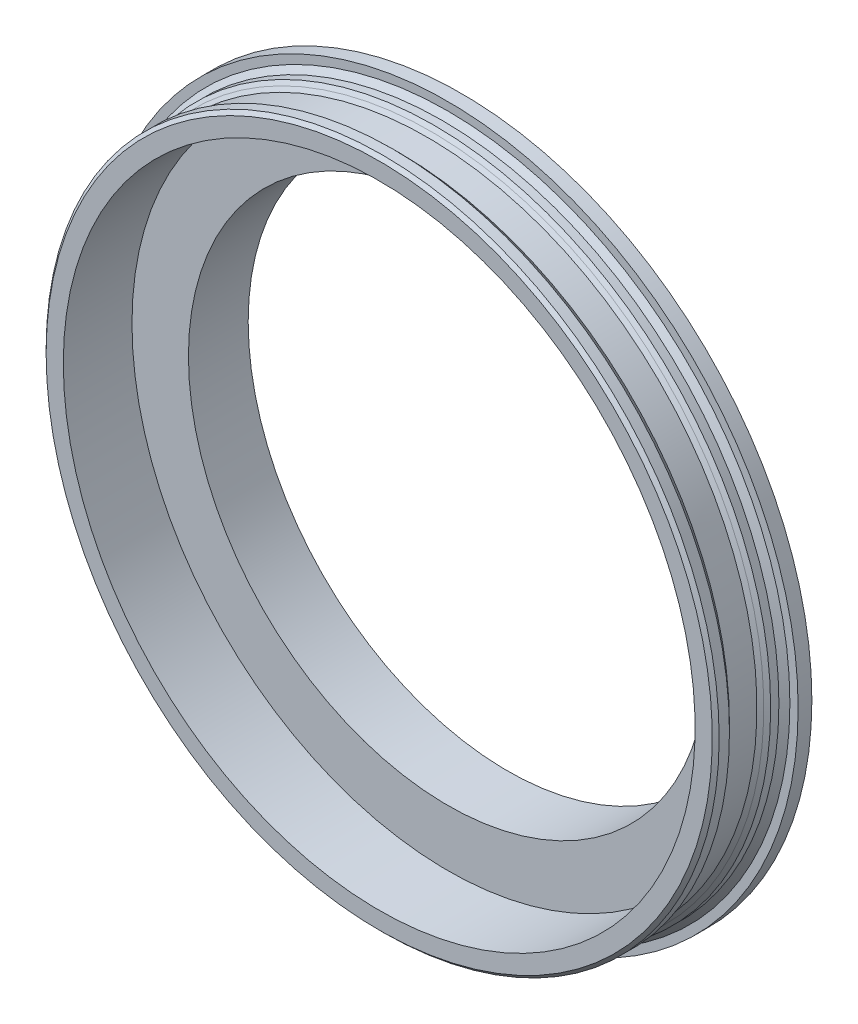
ISO-10303-21;
HEADER;
FILE_DESCRIPTION(('STEP AP214'),'2;1');
FILE_NAME('part.step','',(''),(''),'','','');
FILE_SCHEMA(('AUTOMOTIVE_DESIGN { 1 0 10303 214 1 1 1 1 }'));
ENDSEC;
DATA;
#1=APPLICATION_CONTEXT('core data for automotive mechanical design processes');
#2=APPLICATION_PROTOCOL_DEFINITION('international standard','automotive_design',2000,#1);
#3=PRODUCT_CONTEXT('',#1,'mechanical');
#4=PRODUCT('Part','Part','',(#3));
#5=PRODUCT_RELATED_PRODUCT_CATEGORY('part','',(#4));
#6=PRODUCT_DEFINITION_FORMATION('','',#4);
#7=PRODUCT_DEFINITION_CONTEXT('part definition',#1,'design');
#8=PRODUCT_DEFINITION('design','',#6,#7);
#9=PRODUCT_DEFINITION_SHAPE('','',#8);
#10=(LENGTH_UNIT() NAMED_UNIT(*) SI_UNIT(.MILLI.,.METRE.));
#11=(NAMED_UNIT(*) PLANE_ANGLE_UNIT() SI_UNIT($,.RADIAN.));
#12=(NAMED_UNIT(*) SI_UNIT($,.STERADIAN.) SOLID_ANGLE_UNIT());
#13=UNCERTAINTY_MEASURE_WITH_UNIT(LENGTH_MEASURE(1.E-05),#10,'distance_accuracy_value','');
#14=(GEOMETRIC_REPRESENTATION_CONTEXT(3) GLOBAL_UNCERTAINTY_ASSIGNED_CONTEXT((#13)) GLOBAL_UNIT_ASSIGNED_CONTEXT((#10,
#11,#12)) REPRESENTATION_CONTEXT('',''));
#15=CARTESIAN_POINT('',(0.,0.,0.));
#16=DIRECTION('',(0.,0.,1.));
#17=DIRECTION('',(1.,0.,0.));
#18=AXIS2_PLACEMENT_3D('',#15,#16,#17);
#19=CARTESIAN_POINT('',(39.78,0.,0.));
#20=DIRECTION('',(0.,0.,1.));
#21=DIRECTION('',(1.,0.,0.));
#22=AXIS2_PLACEMENT_3D('',#19,#20,#21);
#23=PLANE('',#22);
#24=CARTESIAN_POINT('',(0.,0.,0.));
#25=DIRECTION('',(0.,0.,1.));
#26=DIRECTION('',(1.,0.,0.));
#27=AXIS2_PLACEMENT_3D('',#24,#25,#26);
#28=CIRCLE('',#27,39.28);
#29=CARTESIAN_POINT('',(39.28,0.,0.));
#30=VERTEX_POINT('',#29);
#31=EDGE_CURVE('E70',#30,#30,#28,.F.);
#32=ORIENTED_EDGE('',*,*,#31,.T.);
#33=EDGE_LOOP('',(#32));
#34=FACE_BOUND('',#33,.T.);
#35=CARTESIAN_POINT('',(0.,0.,0.));
#36=DIRECTION('',(0.,0.,-1.));
#37=DIRECTION('',(-1.,0.,0.));
#38=AXIS2_PLACEMENT_3D('',#35,#36,#37);
#39=CIRCLE('',#38,37.78);
#40=CARTESIAN_POINT('',(-37.78,0.,0.));
#41=VERTEX_POINT('',#40);
#42=EDGE_CURVE('E82',#41,#41,#39,.T.);
#43=ORIENTED_EDGE('',*,*,#42,.F.);
#44=EDGE_LOOP('',(#43));
#45=FACE_BOUND('',#44,.T.);
#46=ADVANCED_FACE('F37',(#34,#45),#23,.F.);
#47=CARTESIAN_POINT('',(0.,0.,-73.9813673678491));
#48=DIRECTION('',(0.,0.,-1.));
#49=DIRECTION('',(-1.,0.,0.));
#50=AXIS2_PLACEMENT_3D('',#47,#48,#49);
#51=CYLINDRICAL_SURFACE('',#50,37.78);
#52=CARTESIAN_POINT('',(0.,0.,8.7));
#53=DIRECTION('',(0.,0.,-1.));
#54=DIRECTION('',(-1.,0.,0.));
#55=AXIS2_PLACEMENT_3D('',#52,#53,#54);
#56=CIRCLE('',#55,37.78);
#57=CARTESIAN_POINT('',(-37.78,0.,8.7));
#58=VERTEX_POINT('',#57);
#59=EDGE_CURVE('E85',#58,#58,#56,.T.);
#60=ORIENTED_EDGE('',*,*,#59,.F.);
#61=EDGE_LOOP('',(#60));
#62=FACE_BOUND('',#61,.T.);
#63=ORIENTED_EDGE('',*,*,#42,.T.);
#64=EDGE_LOOP('',(#63));
#65=FACE_BOUND('',#64,.T.);
#66=ADVANCED_FACE('F127',(#62,#65),#51,.F.);
#67=CARTESIAN_POINT('',(37.78,0.,8.7));
#68=DIRECTION('',(0.,0.,-1.));
#69=DIRECTION('',(-1.,0.,0.));
#70=AXIS2_PLACEMENT_3D('',#67,#68,#69);
#71=PLANE('',#70);
#72=CARTESIAN_POINT('',(0.,0.,8.7));
#73=DIRECTION('',(0.,0.,-1.));
#74=DIRECTION('',(-1.,0.,0.));
#75=AXIS2_PLACEMENT_3D('',#72,#73,#74);
#76=CIRCLE('',#75,46.);
#77=CARTESIAN_POINT('',(-46.,0.,8.7));
#78=VERTEX_POINT('',#77);
#79=EDGE_CURVE('E88',#78,#78,#76,.T.);
#80=ORIENTED_EDGE('',*,*,#79,.F.);
#81=EDGE_LOOP('',(#80));
#82=FACE_BOUND('',#81,.T.);
#83=ORIENTED_EDGE('',*,*,#59,.T.);
#84=EDGE_LOOP('',(#83));
#85=FACE_BOUND('',#84,.T.);
#86=ADVANCED_FACE('F133',(#82,#85),#71,.F.);
#87=CARTESIAN_POINT('',(0.,0.,-73.9813673678491));
#88=DIRECTION('',(0.,0.,-1.));
#89=DIRECTION('',(-1.,0.,0.));
#90=AXIS2_PLACEMENT_3D('',#87,#88,#89);
#91=CYLINDRICAL_SURFACE('',#90,46.);
#92=CARTESIAN_POINT('',(0.,0.,18.7));
#93=DIRECTION('',(0.,0.,-1.));
#94=DIRECTION('',(-1.,0.,0.));
#95=AXIS2_PLACEMENT_3D('',#92,#93,#94);
#96=CIRCLE('',#95,46.);
#97=CARTESIAN_POINT('',(-46.,0.,18.7));
#98=VERTEX_POINT('',#97);
#99=EDGE_CURVE('E91',#98,#98,#96,.T.);
#100=ORIENTED_EDGE('',*,*,#99,.F.);
#101=EDGE_LOOP('',(#100));
#102=FACE_BOUND('',#101,.T.);
#103=ORIENTED_EDGE('',*,*,#79,.T.);
#104=EDGE_LOOP('',(#103));
#105=FACE_BOUND('',#104,.T.);
#106=ADVANCED_FACE('F182',(#102,#105),#91,.F.);
#107=CARTESIAN_POINT('',(46.,0.,18.7));
#108=DIRECTION('',(0.,0.,-1.));
#109=DIRECTION('',(-1.,0.,0.));
#110=AXIS2_PLACEMENT_3D('',#107,#108,#109);
#111=PLANE('',#110);
#112=CARTESIAN_POINT('',(0.,0.,18.7));
#113=DIRECTION('',(0.,0.,-1.));
#114=DIRECTION('',(-1.,0.,0.));
#115=AXIS2_PLACEMENT_3D('',#112,#113,#114);
#116=CIRCLE('',#115,48.5);
#117=CARTESIAN_POINT('',(-48.5,0.,18.7));
#118=VERTEX_POINT('',#117);
#119=EDGE_CURVE('E73',#118,#118,#116,.F.);
#120=ORIENTED_EDGE('',*,*,#119,.T.);
#121=EDGE_LOOP('',(#120));
#122=FACE_BOUND('',#121,.T.);
#123=ORIENTED_EDGE('',*,*,#99,.T.);
#124=EDGE_LOOP('',(#123));
#125=FACE_BOUND('',#124,.T.);
#126=ADVANCED_FACE('F176',(#122,#125),#111,.F.);
#127=CARTESIAN_POINT('',(0.,0.,-73.9813673678491));
#128=DIRECTION('',(0.,0.,-1.));
#129=DIRECTION('',(-1.,0.,0.));
#130=AXIS2_PLACEMENT_3D('',#127,#128,#129);
#131=CYLINDRICAL_SURFACE('',#130,49.);
#132=CARTESIAN_POINT('',(0.,0.,18.2));
#133=DIRECTION('',(0.,0.,-1.));
#134=DIRECTION('',(-1.,0.,0.));
#135=AXIS2_PLACEMENT_3D('',#132,#133,#134);
#136=CIRCLE('',#135,49.);
#137=CARTESIAN_POINT('',(-49.,0.,18.2));
#138=VERTEX_POINT('',#137);
#139=EDGE_CURVE('E76',#138,#138,#136,.T.);
#140=ORIENTED_EDGE('',*,*,#139,.T.);
#141=EDGE_LOOP('',(#140));
#142=FACE_BOUND('',#141,.T.);
#143=CARTESIAN_POINT('',(0.,0.,16.7));
#144=DIRECTION('',(0.,0.,1.));
#145=DIRECTION('',(1.,0.,0.));
#146=AXIS2_PLACEMENT_3D('',#143,#144,#145);
#147=CIRCLE('',#146,49.);
#148=CARTESIAN_POINT('',(49.,0.,16.7));
#149=VERTEX_POINT('',#148);
#150=EDGE_CURVE('E79',#149,#149,#147,.T.);
#151=ORIENTED_EDGE('',*,*,#150,.T.);
#152=EDGE_LOOP('',(#151));
#153=FACE_BOUND('',#152,.T.);
#154=ADVANCED_FACE('F170',(#142,#153),#131,.T.);
#155=CARTESIAN_POINT('',(0.,0.,-73.9813673678491));
#156=DIRECTION('',(0.,0.,-1.));
#157=DIRECTION('',(-1.,0.,0.));
#158=AXIS2_PLACEMENT_3D('',#155,#156,#157);
#159=CYLINDRICAL_SURFACE('',#158,48.);
#160=CARTESIAN_POINT('',(0.,0.,11.7));
#161=DIRECTION('',(0.,0.,-1.));
#162=DIRECTION('',(-1.,0.,0.));
#163=AXIS2_PLACEMENT_3D('',#160,#161,#162);
#164=CIRCLE('',#163,48.);
#165=CARTESIAN_POINT('',(-48.,0.,11.7));
#166=VERTEX_POINT('',#165);
#167=EDGE_CURVE('E48',#166,#166,#164,.F.);
#168=ORIENTED_EDGE('',*,*,#167,.T.);
#169=EDGE_LOOP('',(#168));
#170=FACE_BOUND('',#169,.T.);
#171=CARTESIAN_POINT('',(0.,0.,15.7));
#172=DIRECTION('',(0.,0.,1.));
#173=DIRECTION('',(1.,0.,0.));
#174=AXIS2_PLACEMENT_3D('',#171,#172,#173);
#175=CIRCLE('',#174,48.);
#176=CARTESIAN_POINT('',(48.,0.,15.7));
#177=VERTEX_POINT('',#176);
#178=EDGE_CURVE('E52',#177,#177,#175,.F.);
#179=ORIENTED_EDGE('',*,*,#178,.T.);
#180=EDGE_LOOP('',(#179));
#181=FACE_BOUND('',#180,.T.);
#182=ADVANCED_FACE('F124',(#170,#181),#159,.T.);
#183=CARTESIAN_POINT('',(0.,0.,-73.9813673678491));
#184=DIRECTION('',(0.,0.,-1.));
#185=DIRECTION('',(-1.,0.,0.));
#186=AXIS2_PLACEMENT_3D('',#183,#184,#185);
#187=CYLINDRICAL_SURFACE('',#186,49.);
#188=CARTESIAN_POINT('',(0.,0.,9.49999999999997));
#189=DIRECTION('',(0.,0.,-1.));
#190=DIRECTION('',(-1.,0.,0.));
#191=AXIS2_PLACEMENT_3D('',#188,#189,#190);
#192=CIRCLE('',#191,49.);
#193=CARTESIAN_POINT('',(-49.,0.,9.49999999999997));
#194=VERTEX_POINT('',#193);
#195=EDGE_CURVE('E10',#194,#194,#192,.F.);
#196=ORIENTED_EDGE('',*,*,#195,.T.);
#197=EDGE_LOOP('',(#196));
#198=FACE_BOUND('',#197,.T.);
#199=CARTESIAN_POINT('',(0.,0.,10.7));
#200=DIRECTION('',(0.,0.,-1.));
#201=DIRECTION('',(-1.,0.,0.));
#202=AXIS2_PLACEMENT_3D('',#199,#200,#201);
#203=CIRCLE('',#202,49.);
#204=CARTESIAN_POINT('',(-49.,0.,10.7));
#205=VERTEX_POINT('',#204);
#206=EDGE_CURVE('E64',#205,#205,#203,.T.);
#207=ORIENTED_EDGE('',*,*,#206,.T.);
#208=EDGE_LOOP('',(#207));
#209=FACE_BOUND('',#208,.T.);
#210=ADVANCED_FACE('F119',(#198,#209),#187,.T.);
#211=CARTESIAN_POINT('',(49.,0.,8.7));
#212=DIRECTION('',(0.,0.,-1.));
#213=DIRECTION('',(-1.,0.,0.));
#214=AXIS2_PLACEMENT_3D('',#211,#212,#213);
#215=PLANE('',#214);
#216=CARTESIAN_POINT('',(0.,0.,8.7));
#217=DIRECTION('',(0.,0.,-1.));
#218=DIRECTION('',(-1.,0.,0.));
#219=AXIS2_PLACEMENT_3D('',#216,#217,#218);
#220=CIRCLE('',#219,49.8);
#221=CARTESIAN_POINT('',(-49.8,0.,8.7));
#222=VERTEX_POINT('',#221);
#223=EDGE_CURVE('E44',#222,#222,#220,.T.);
#224=ORIENTED_EDGE('',*,*,#223,.T.);
#225=EDGE_LOOP('',(#224));
#226=FACE_BOUND('',#225,.T.);
#227=CARTESIAN_POINT('',(0.,0.,8.7));
#228=DIRECTION('',(0.,0.,-1.));
#229=DIRECTION('',(-1.,0.,0.));
#230=AXIS2_PLACEMENT_3D('',#227,#228,#229);
#231=CIRCLE('',#230,51.);
#232=CARTESIAN_POINT('',(-51.,0.,8.7));
#233=VERTEX_POINT('',#232);
#234=EDGE_CURVE('E94',#233,#233,#231,.T.);
#235=ORIENTED_EDGE('',*,*,#234,.F.);
#236=EDGE_LOOP('',(#235));
#237=FACE_BOUND('',#236,.T.);
#238=ADVANCED_FACE('F114',(#226,#237),#215,.F.);
#239=CARTESIAN_POINT('',(0.,0.,-73.9813673678491));
#240=DIRECTION('',(0.,0.,-1.));
#241=DIRECTION('',(-1.,0.,0.));
#242=AXIS2_PLACEMENT_3D('',#239,#240,#241);
#243=CYLINDRICAL_SURFACE('',#242,51.);
#244=CARTESIAN_POINT('',(0.,0.,6.70000000000001));
#245=DIRECTION('',(0.,0.,-1.));
#246=DIRECTION('',(-1.,0.,0.));
#247=AXIS2_PLACEMENT_3D('',#244,#245,#246);
#248=CIRCLE('',#247,51.);
#249=CARTESIAN_POINT('',(-51.,0.,6.70000000000001));
#250=VERTEX_POINT('',#249);
#251=EDGE_CURVE('E97',#250,#250,#248,.T.);
#252=ORIENTED_EDGE('',*,*,#251,.F.);
#253=EDGE_LOOP('',(#252));
#254=FACE_BOUND('',#253,.T.);
#255=ORIENTED_EDGE('',*,*,#234,.T.);
#256=EDGE_LOOP('',(#255));
#257=FACE_BOUND('',#256,.T.);
#258=ADVANCED_FACE('F108',(#254,#257),#243,.T.);
#259=CARTESIAN_POINT('',(51.,0.,6.70000000000001));
#260=DIRECTION('',(0.,0.,1.));
#261=DIRECTION('',(1.,0.,0.));
#262=AXIS2_PLACEMENT_3D('',#259,#260,#261);
#263=PLANE('',#262);
#264=CARTESIAN_POINT('',(0.,0.,6.70000000000001));
#265=DIRECTION('',(0.,0.,-1.));
#266=DIRECTION('',(-1.,0.,0.));
#267=AXIS2_PLACEMENT_3D('',#264,#265,#266);
#268=CIRCLE('',#267,39.78);
#269=CARTESIAN_POINT('',(-39.78,0.,6.70000000000001));
#270=VERTEX_POINT('',#269);
#271=EDGE_CURVE('E60',#270,#270,#268,.T.);
#272=ORIENTED_EDGE('',*,*,#271,.F.);
#273=EDGE_LOOP('',(#272));
#274=FACE_BOUND('',#273,.T.);
#275=ORIENTED_EDGE('',*,*,#251,.T.);
#276=EDGE_LOOP('',(#275));
#277=FACE_BOUND('',#276,.T.);
#278=ADVANCED_FACE('F105',(#274,#277),#263,.F.);
#279=CARTESIAN_POINT('',(0.,0.,-73.9813673678491));
#280=DIRECTION('',(0.,0.,-1.));
#281=DIRECTION('',(-1.,0.,0.));
#282=AXIS2_PLACEMENT_3D('',#279,#280,#281);
#283=CYLINDRICAL_SURFACE('',#282,39.78);
#284=CARTESIAN_POINT('',(0.,0.,0.500000000000014));
#285=DIRECTION('',(0.,0.,1.));
#286=DIRECTION('',(1.,0.,0.));
#287=AXIS2_PLACEMENT_3D('',#284,#285,#286);
#288=CIRCLE('',#287,39.78);
#289=CARTESIAN_POINT('',(39.78,0.,0.500000000000014));
#290=VERTEX_POINT('',#289);
#291=EDGE_CURVE('E67',#290,#290,#288,.T.);
#292=ORIENTED_EDGE('',*,*,#291,.T.);
#293=EDGE_LOOP('',(#292));
#294=FACE_BOUND('',#293,.T.);
#295=ORIENTED_EDGE('',*,*,#271,.T.);
#296=EDGE_LOOP('',(#295));
#297=FACE_BOUND('',#296,.T.);
#298=ADVANCED_FACE('F103',(#294,#297),#283,.T.);
#299=CARTESIAN_POINT('',(0.,0.,18.2));
#300=DIRECTION('',(0.,0.,-1.));
#301=DIRECTION('',(-1.,0.,0.));
#302=AXIS2_PLACEMENT_3D('',#299,#300,#301);
#303=CONICAL_SURFACE('',#302,49.,0.785398163397448);
#304=ORIENTED_EDGE('',*,*,#119,.F.);
#305=EDGE_LOOP('',(#304));
#306=FACE_BOUND('',#305,.T.);
#307=ORIENTED_EDGE('',*,*,#139,.F.);
#308=EDGE_LOOP('',(#307));
#309=FACE_BOUND('',#308,.T.);
#310=ADVANCED_FACE('F139',(#306,#309),#303,.T.);
#311=CARTESIAN_POINT('',(0.,0.,0.));
#312=DIRECTION('',(0.,0.,1.));
#313=DIRECTION('',(1.,0.,0.));
#314=AXIS2_PLACEMENT_3D('',#311,#312,#313);
#315=CONICAL_SURFACE('',#314,39.28,0.785398163397448);
#316=ORIENTED_EDGE('',*,*,#291,.F.);
#317=EDGE_LOOP('',(#316));
#318=FACE_BOUND('',#317,.T.);
#319=ORIENTED_EDGE('',*,*,#31,.F.);
#320=EDGE_LOOP('',(#319));
#321=FACE_BOUND('',#320,.T.);
#322=ADVANCED_FACE('F142',(#318,#321),#315,.T.);
#323=CARTESIAN_POINT('',(0.,0.,11.2));
#324=DIRECTION('',(0.,0.,-1.));
#325=DIRECTION('',(-1.,0.,0.));
#326=AXIS2_PLACEMENT_3D('',#323,#324,#325);
#327=CONICAL_SURFACE('',#326,48.5,0.785398163397462);
#328=ORIENTED_EDGE('',*,*,#167,.F.);
#329=EDGE_LOOP('',(#328));
#330=FACE_BOUND('',#329,.T.);
#331=CARTESIAN_POINT('',(0.,0.,11.2));
#332=DIRECTION('',(0.,0.,-1.));
#333=DIRECTION('',(-1.,0.,0.));
#334=AXIS2_PLACEMENT_3D('',#331,#332,#333);
#335=CIRCLE('',#334,48.5);
#336=CARTESIAN_POINT('',(-48.5,0.,11.2));
#337=VERTEX_POINT('',#336);
#338=EDGE_CURVE('E58',#337,#337,#335,.T.);
#339=ORIENTED_EDGE('',*,*,#338,.F.);
#340=EDGE_LOOP('',(#339));
#341=FACE_BOUND('',#340,.T.);
#342=ADVANCED_FACE('F146',(#330,#341),#327,.T.);
#343=CARTESIAN_POINT('',(0.,0.,10.7));
#344=DIRECTION('',(0.,0.,-1.));
#345=DIRECTION('',(-1.,0.,0.));
#346=AXIS2_PLACEMENT_3D('',#343,#344,#345);
#347=CONICAL_SURFACE('',#346,49.,0.785398163397441);
#348=ORIENTED_EDGE('',*,*,#338,.T.);
#349=EDGE_LOOP('',(#348));
#350=FACE_BOUND('',#349,.T.);
#351=ORIENTED_EDGE('',*,*,#206,.F.);
#352=EDGE_LOOP('',(#351));
#353=FACE_BOUND('',#352,.T.);
#354=ADVANCED_FACE('F148',(#350,#353),#347,.T.);
#355=CARTESIAN_POINT('',(0.,0.,16.2));
#356=DIRECTION('',(0.,0.,1.));
#357=DIRECTION('',(1.,0.,0.));
#358=AXIS2_PLACEMENT_3D('',#355,#356,#357);
#359=CONICAL_SURFACE('',#358,48.5,0.785398163397448);
#360=ORIENTED_EDGE('',*,*,#150,.F.);
#361=EDGE_LOOP('',(#360));
#362=FACE_BOUND('',#361,.T.);
#363=CARTESIAN_POINT('',(0.,0.,16.2));
#364=DIRECTION('',(0.,0.,1.));
#365=DIRECTION('',(1.,0.,0.));
#366=AXIS2_PLACEMENT_3D('',#363,#364,#365);
#367=CIRCLE('',#366,48.5);
#368=CARTESIAN_POINT('',(48.5,0.,16.2));
#369=VERTEX_POINT('',#368);
#370=EDGE_CURVE('E55',#369,#369,#367,.F.);
#371=ORIENTED_EDGE('',*,*,#370,.F.);
#372=EDGE_LOOP('',(#371));
#373=FACE_BOUND('',#372,.T.);
#374=ADVANCED_FACE('F151',(#362,#373),#359,.T.);
#375=CARTESIAN_POINT('',(0.,0.,15.7));
#376=DIRECTION('',(0.,0.,1.));
#377=DIRECTION('',(1.,0.,0.));
#378=AXIS2_PLACEMENT_3D('',#375,#376,#377);
#379=CONICAL_SURFACE('',#378,48.,0.785398163397462);
#380=ORIENTED_EDGE('',*,*,#370,.T.);
#381=EDGE_LOOP('',(#380));
#382=FACE_BOUND('',#381,.T.);
#383=ORIENTED_EDGE('',*,*,#178,.F.);
#384=EDGE_LOOP('',(#383));
#385=FACE_BOUND('',#384,.T.);
#386=ADVANCED_FACE('F156',(#382,#385),#379,.T.);
#387=CARTESIAN_POINT('',(0.,0.,8.7));
#388=DIRECTION('',(0.,0.,-1.));
#389=DIRECTION('',(-1.,0.,0.));
#390=AXIS2_PLACEMENT_3D('',#387,#388,#389);
#391=CONICAL_SURFACE('',#390,49.8,0.785398163397448);
#392=ORIENTED_EDGE('',*,*,#195,.F.);
#393=EDGE_LOOP('',(#392));
#394=FACE_BOUND('',#393,.T.);
#395=ORIENTED_EDGE('',*,*,#223,.F.);
#396=EDGE_LOOP('',(#395));
#397=FACE_BOUND('',#396,.T.);
#398=ADVANCED_FACE('F39',(#394,#397),#391,.T.);
#399=CLOSED_SHELL('',(#46,#66,#86,#106,#126,#154,#182,#210,#238,#258,#278,#298,#310,#322,#342,
#354,#374,#386,#398));
#400=MANIFOLD_SOLID_BREP('B2',#399);
#401=ADVANCED_BREP_SHAPE_REPRESENTATION('',(#18,#400),#14);
#402=SHAPE_DEFINITION_REPRESENTATION(#9,#401);
ENDSEC;
END-ISO-10303-21;
